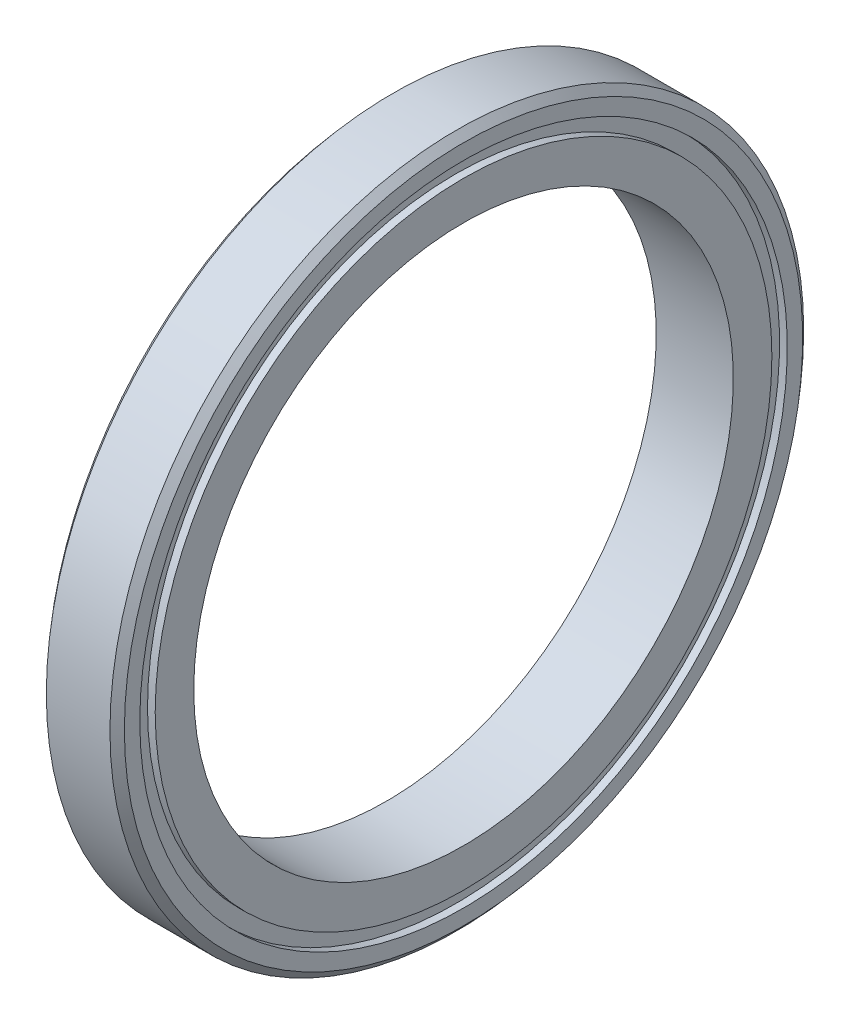
ISO-10303-21;
HEADER;
FILE_DESCRIPTION(('STEP AP214'),'2;1');
FILE_NAME('part.step','',(''),(''),'','','');
FILE_SCHEMA(('AUTOMOTIVE_DESIGN { 1 0 10303 214 1 1 1 1 }'));
ENDSEC;
DATA;
#1=APPLICATION_CONTEXT('core data for automotive mechanical design processes');
#2=APPLICATION_PROTOCOL_DEFINITION('international standard','automotive_design',2000,#1);
#3=PRODUCT_CONTEXT('',#1,'mechanical');
#4=PRODUCT('Part','Part','',(#3));
#5=PRODUCT_RELATED_PRODUCT_CATEGORY('part','',(#4));
#6=PRODUCT_DEFINITION_FORMATION('','',#4);
#7=PRODUCT_DEFINITION_CONTEXT('part definition',#1,'design');
#8=PRODUCT_DEFINITION('design','',#6,#7);
#9=PRODUCT_DEFINITION_SHAPE('','',#8);
#10=(LENGTH_UNIT() NAMED_UNIT(*) SI_UNIT(.MILLI.,.METRE.));
#11=(NAMED_UNIT(*) PLANE_ANGLE_UNIT() SI_UNIT($,.RADIAN.));
#12=(NAMED_UNIT(*) SI_UNIT($,.STERADIAN.) SOLID_ANGLE_UNIT());
#13=UNCERTAINTY_MEASURE_WITH_UNIT(LENGTH_MEASURE(1.E-05),#10,'distance_accuracy_value','');
#14=(GEOMETRIC_REPRESENTATION_CONTEXT(3) GLOBAL_UNCERTAINTY_ASSIGNED_CONTEXT((#13)) GLOBAL_UNIT_ASSIGNED_CONTEXT((#10,
#11,#12)) REPRESENTATION_CONTEXT('',''));
#15=CARTESIAN_POINT('',(0.,0.,0.));
#16=DIRECTION('',(0.,0.,1.));
#17=DIRECTION('',(1.,0.,0.));
#18=AXIS2_PLACEMENT_3D('',#15,#16,#17);
#19=CARTESIAN_POINT('',(2.84469849092037,35.,0.));
#20=DIRECTION('',(-1.,0.,0.));
#21=DIRECTION('',(0.,0.,1.));
#22=AXIS2_PLACEMENT_3D('',#19,#20,#21);
#23=PLANE('',#22);
#24=CARTESIAN_POINT('',(2.84469849092037,0.,0.));
#25=DIRECTION('',(-1.,0.,0.));
#26=DIRECTION('',(0.,0.,1.));
#27=AXIS2_PLACEMENT_3D('',#24,#25,#26);
#28=CIRCLE('',#27,40.);
#29=CARTESIAN_POINT('',(2.84469849092037,0.,40.));
#30=VERTEX_POINT('',#29);
#31=EDGE_CURVE('E10',#30,#30,#28,.T.);
#32=ORIENTED_EDGE('',*,*,#31,.F.);
#33=EDGE_LOOP('',(#32));
#34=FACE_BOUND('',#33,.T.);
#35=CARTESIAN_POINT('',(2.84469849092037,0.,0.));
#36=DIRECTION('',(-1.,0.,0.));
#37=DIRECTION('',(0.,0.,1.));
#38=AXIS2_PLACEMENT_3D('',#35,#36,#37);
#39=CIRCLE('',#38,35.);
#40=CARTESIAN_POINT('',(2.84469849092037,0.,35.));
#41=VERTEX_POINT('',#40);
#42=EDGE_CURVE('E77',#41,#41,#39,.T.);
#43=ORIENTED_EDGE('',*,*,#42,.T.);
#44=EDGE_LOOP('',(#43));
#45=FACE_BOUND('',#44,.T.);
#46=ADVANCED_FACE('F31',(#34,#45),#23,.F.);
#47=CARTESIAN_POINT('',(0.,0.,0.));
#48=DIRECTION('',(-1.,0.,0.));
#49=DIRECTION('',(0.,0.,1.));
#50=AXIS2_PLACEMENT_3D('',#47,#48,#49);
#51=CYLINDRICAL_SURFACE('',#50,40.);
#52=CARTESIAN_POINT('',(1.84469849092037,0.,0.));
#53=DIRECTION('',(-1.,0.,0.));
#54=DIRECTION('',(0.,0.,1.));
#55=AXIS2_PLACEMENT_3D('',#52,#53,#54);
#56=CIRCLE('',#55,40.);
#57=CARTESIAN_POINT('',(1.84469849092037,0.,40.));
#58=VERTEX_POINT('',#57);
#59=EDGE_CURVE('E37',#58,#58,#56,.T.);
#60=ORIENTED_EDGE('',*,*,#59,.F.);
#61=EDGE_LOOP('',(#60));
#62=FACE_BOUND('',#61,.T.);
#63=ORIENTED_EDGE('',*,*,#31,.T.);
#64=EDGE_LOOP('',(#63));
#65=FACE_BOUND('',#64,.T.);
#66=ADVANCED_FACE('F150',(#62,#65),#51,.T.);
#67=CARTESIAN_POINT('',(1.84469849092037,40.,0.));
#68=DIRECTION('',(-1.,0.,0.));
#69=DIRECTION('',(0.,0.,1.));
#70=AXIS2_PLACEMENT_3D('',#67,#68,#69);
#71=PLANE('',#70);
#72=CARTESIAN_POINT('',(1.84469849092037,0.,0.));
#73=DIRECTION('',(-1.,0.,0.));
#74=DIRECTION('',(0.,0.,1.));
#75=AXIS2_PLACEMENT_3D('',#72,#73,#74);
#76=CIRCLE('',#75,42.);
#77=CARTESIAN_POINT('',(1.84469849092037,0.,42.));
#78=VERTEX_POINT('',#77);
#79=EDGE_CURVE('E41',#78,#78,#76,.T.);
#80=ORIENTED_EDGE('',*,*,#79,.F.);
#81=EDGE_LOOP('',(#80));
#82=FACE_BOUND('',#81,.T.);
#83=ORIENTED_EDGE('',*,*,#59,.T.);
#84=EDGE_LOOP('',(#83));
#85=FACE_BOUND('',#84,.T.);
#86=ADVANCED_FACE('F145',(#82,#85),#71,.F.);
#87=CARTESIAN_POINT('',(0.,0.,0.));
#88=DIRECTION('',(-1.,0.,0.));
#89=DIRECTION('',(0.,0.,1.));
#90=AXIS2_PLACEMENT_3D('',#87,#88,#89);
#91=CYLINDRICAL_SURFACE('',#90,42.);
#92=CARTESIAN_POINT('',(2.84469849092037,0.,0.));
#93=DIRECTION('',(-1.,0.,0.));
#94=DIRECTION('',(0.,0.,1.));
#95=AXIS2_PLACEMENT_3D('',#92,#93,#94);
#96=CIRCLE('',#95,42.);
#97=CARTESIAN_POINT('',(2.84469849092037,0.,42.));
#98=VERTEX_POINT('',#97);
#99=EDGE_CURVE('E45',#98,#98,#96,.T.);
#100=ORIENTED_EDGE('',*,*,#99,.F.);
#101=EDGE_LOOP('',(#100));
#102=FACE_BOUND('',#101,.T.);
#103=ORIENTED_EDGE('',*,*,#79,.T.);
#104=EDGE_LOOP('',(#103));
#105=FACE_BOUND('',#104,.T.);
#106=ADVANCED_FACE('F139',(#102,#105),#91,.F.);
#107=CARTESIAN_POINT('',(2.84469849092037,42.,0.));
#108=DIRECTION('',(-1.,0.,0.));
#109=DIRECTION('',(0.,0.,1.));
#110=AXIS2_PLACEMENT_3D('',#107,#108,#109);
#111=PLANE('',#110);
#112=CARTESIAN_POINT('',(2.84469849092037,0.,0.));
#113=DIRECTION('',(-1.,0.,0.));
#114=DIRECTION('',(0.,0.,1.));
#115=AXIS2_PLACEMENT_3D('',#112,#113,#114);
#116=CIRCLE('',#115,44.);
#117=CARTESIAN_POINT('',(2.84469849092037,0.,44.));
#118=VERTEX_POINT('',#117);
#119=EDGE_CURVE('E50',#118,#118,#116,.T.);
#120=ORIENTED_EDGE('',*,*,#119,.F.);
#121=EDGE_LOOP('',(#120));
#122=FACE_BOUND('',#121,.T.);
#123=ORIENTED_EDGE('',*,*,#99,.T.);
#124=EDGE_LOOP('',(#123));
#125=FACE_BOUND('',#124,.T.);
#126=ADVANCED_FACE('F133',(#122,#125),#111,.F.);
#127=CARTESIAN_POINT('',(2.84469849092037,0.,0.));
#128=DIRECTION('',(-1.,0.,0.));
#129=DIRECTION('',(0.,0.,1.));
#130=AXIS2_PLACEMENT_3D('',#127,#128,#129);
#131=CONICAL_SURFACE('',#130,44.,0.852995114383051);
#132=CARTESIAN_POINT('',(1.97151331029781,0.,0.));
#133=DIRECTION('',(-1.,0.,0.));
#134=DIRECTION('',(0.,0.,1.));
#135=AXIS2_PLACEMENT_3D('',#132,#133,#134);
#136=CIRCLE('',#135,45.);
#137=CARTESIAN_POINT('',(1.97151331029781,0.,45.));
#138=VERTEX_POINT('',#137);
#139=EDGE_CURVE('E53',#138,#138,#136,.T.);
#140=ORIENTED_EDGE('',*,*,#139,.F.);
#141=EDGE_LOOP('',(#140));
#142=FACE_BOUND('',#141,.T.);
#143=ORIENTED_EDGE('',*,*,#119,.T.);
#144=EDGE_LOOP('',(#143));
#145=FACE_BOUND('',#144,.T.);
#146=ADVANCED_FACE('F127',(#142,#145),#131,.T.);
#147=CARTESIAN_POINT('',(0.,0.,0.));
#148=DIRECTION('',(-1.,0.,0.));
#149=DIRECTION('',(0.,0.,1.));
#150=AXIS2_PLACEMENT_3D('',#147,#148,#149);
#151=CYLINDRICAL_SURFACE('',#150,45.);
#152=CARTESIAN_POINT('',(-6.28211632845708,0.,0.));
#153=DIRECTION('',(-1.,0.,0.));
#154=DIRECTION('',(0.,0.,1.));
#155=AXIS2_PLACEMENT_3D('',#152,#153,#154);
#156=CIRCLE('',#155,45.);
#157=CARTESIAN_POINT('',(-6.28211632845708,0.,45.));
#158=VERTEX_POINT('',#157);
#159=EDGE_CURVE('E56',#158,#158,#156,.T.);
#160=ORIENTED_EDGE('',*,*,#159,.F.);
#161=EDGE_LOOP('',(#160));
#162=FACE_BOUND('',#161,.T.);
#163=ORIENTED_EDGE('',*,*,#139,.T.);
#164=EDGE_LOOP('',(#163));
#165=FACE_BOUND('',#164,.T.);
#166=ADVANCED_FACE('F121',(#162,#165),#151,.T.);
#167=CARTESIAN_POINT('',(-6.28211632845708,0.,0.));
#168=DIRECTION('',(1.,0.,0.));
#169=DIRECTION('',(0.,0.,-1.));
#170=AXIS2_PLACEMENT_3D('',#167,#168,#169);
#171=CONICAL_SURFACE('',#170,45.,0.85299511438305);
#172=CARTESIAN_POINT('',(-7.15530150907963,0.,0.));
#173=DIRECTION('',(-1.,0.,0.));
#174=DIRECTION('',(0.,0.,1.));
#175=AXIS2_PLACEMENT_3D('',#172,#173,#174);
#176=CIRCLE('',#175,44.);
#177=CARTESIAN_POINT('',(-7.15530150907963,0.,44.));
#178=VERTEX_POINT('',#177);
#179=EDGE_CURVE('E59',#178,#178,#176,.T.);
#180=ORIENTED_EDGE('',*,*,#179,.F.);
#181=EDGE_LOOP('',(#180));
#182=FACE_BOUND('',#181,.T.);
#183=ORIENTED_EDGE('',*,*,#159,.T.);
#184=EDGE_LOOP('',(#183));
#185=FACE_BOUND('',#184,.T.);
#186=ADVANCED_FACE('F115',(#182,#185),#171,.T.);
#187=CARTESIAN_POINT('',(-7.15530150907963,42.,0.));
#188=DIRECTION('',(1.,0.,0.));
#189=DIRECTION('',(0.,0.,-1.));
#190=AXIS2_PLACEMENT_3D('',#187,#188,#189);
#191=PLANE('',#190);
#192=CARTESIAN_POINT('',(-7.15530150907963,0.,0.));
#193=DIRECTION('',(-1.,0.,0.));
#194=DIRECTION('',(0.,0.,1.));
#195=AXIS2_PLACEMENT_3D('',#192,#193,#194);
#196=CIRCLE('',#195,42.);
#197=CARTESIAN_POINT('',(-7.15530150907963,0.,42.));
#198=VERTEX_POINT('',#197);
#199=EDGE_CURVE('E62',#198,#198,#196,.T.);
#200=ORIENTED_EDGE('',*,*,#199,.F.);
#201=EDGE_LOOP('',(#200));
#202=FACE_BOUND('',#201,.T.);
#203=ORIENTED_EDGE('',*,*,#179,.T.);
#204=EDGE_LOOP('',(#203));
#205=FACE_BOUND('',#204,.T.);
#206=ADVANCED_FACE('F109',(#202,#205),#191,.F.);
#207=CARTESIAN_POINT('',(0.,0.,0.));
#208=DIRECTION('',(-1.,0.,0.));
#209=DIRECTION('',(0.,0.,1.));
#210=AXIS2_PLACEMENT_3D('',#207,#208,#209);
#211=CYLINDRICAL_SURFACE('',#210,42.);
#212=CARTESIAN_POINT('',(-6.15530150907963,0.,0.));
#213=DIRECTION('',(-1.,0.,0.));
#214=DIRECTION('',(0.,0.,1.));
#215=AXIS2_PLACEMENT_3D('',#212,#213,#214);
#216=CIRCLE('',#215,42.);
#217=CARTESIAN_POINT('',(-6.15530150907963,0.,42.));
#218=VERTEX_POINT('',#217);
#219=EDGE_CURVE('E65',#218,#218,#216,.T.);
#220=ORIENTED_EDGE('',*,*,#219,.F.);
#221=EDGE_LOOP('',(#220));
#222=FACE_BOUND('',#221,.T.);
#223=ORIENTED_EDGE('',*,*,#199,.T.);
#224=EDGE_LOOP('',(#223));
#225=FACE_BOUND('',#224,.T.);
#226=ADVANCED_FACE('F103',(#222,#225),#211,.F.);
#227=CARTESIAN_POINT('',(-6.15530150907963,40.,0.));
#228=DIRECTION('',(1.,0.,0.));
#229=DIRECTION('',(0.,0.,-1.));
#230=AXIS2_PLACEMENT_3D('',#227,#228,#229);
#231=PLANE('',#230);
#232=CARTESIAN_POINT('',(-6.15530150907963,0.,0.));
#233=DIRECTION('',(-1.,0.,0.));
#234=DIRECTION('',(0.,0.,1.));
#235=AXIS2_PLACEMENT_3D('',#232,#233,#234);
#236=CIRCLE('',#235,40.);
#237=CARTESIAN_POINT('',(-6.15530150907963,0.,40.));
#238=VERTEX_POINT('',#237);
#239=EDGE_CURVE('E68',#238,#238,#236,.T.);
#240=ORIENTED_EDGE('',*,*,#239,.F.);
#241=EDGE_LOOP('',(#240));
#242=FACE_BOUND('',#241,.T.);
#243=ORIENTED_EDGE('',*,*,#219,.T.);
#244=EDGE_LOOP('',(#243));
#245=FACE_BOUND('',#244,.T.);
#246=ADVANCED_FACE('F97',(#242,#245),#231,.F.);
#247=CARTESIAN_POINT('',(0.,0.,0.));
#248=DIRECTION('',(-1.,0.,0.));
#249=DIRECTION('',(0.,0.,1.));
#250=AXIS2_PLACEMENT_3D('',#247,#248,#249);
#251=CYLINDRICAL_SURFACE('',#250,40.);
#252=CARTESIAN_POINT('',(-7.15530150907963,0.,0.));
#253=DIRECTION('',(-1.,0.,0.));
#254=DIRECTION('',(0.,0.,1.));
#255=AXIS2_PLACEMENT_3D('',#252,#253,#254);
#256=CIRCLE('',#255,40.);
#257=CARTESIAN_POINT('',(-7.15530150907963,0.,40.));
#258=VERTEX_POINT('',#257);
#259=EDGE_CURVE('E71',#258,#258,#256,.T.);
#260=ORIENTED_EDGE('',*,*,#259,.F.);
#261=EDGE_LOOP('',(#260));
#262=FACE_BOUND('',#261,.T.);
#263=ORIENTED_EDGE('',*,*,#239,.T.);
#264=EDGE_LOOP('',(#263));
#265=FACE_BOUND('',#264,.T.);
#266=ADVANCED_FACE('F91',(#262,#265),#251,.T.);
#267=CARTESIAN_POINT('',(-7.15530150907963,35.,0.));
#268=DIRECTION('',(1.,0.,0.));
#269=DIRECTION('',(0.,0.,-1.));
#270=AXIS2_PLACEMENT_3D('',#267,#268,#269);
#271=PLANE('',#270);
#272=CARTESIAN_POINT('',(-7.15530150907964,0.,0.));
#273=DIRECTION('',(-1.,0.,0.));
#274=DIRECTION('',(0.,0.,1.));
#275=AXIS2_PLACEMENT_3D('',#272,#273,#274);
#276=CIRCLE('',#275,35.);
#277=CARTESIAN_POINT('',(-7.15530150907964,0.,35.));
#278=VERTEX_POINT('',#277);
#279=EDGE_CURVE('E74',#278,#278,#276,.T.);
#280=ORIENTED_EDGE('',*,*,#279,.F.);
#281=EDGE_LOOP('',(#280));
#282=FACE_BOUND('',#281,.T.);
#283=ORIENTED_EDGE('',*,*,#259,.T.);
#284=EDGE_LOOP('',(#283));
#285=FACE_BOUND('',#284,.T.);
#286=ADVANCED_FACE('F85',(#282,#285),#271,.F.);
#287=CARTESIAN_POINT('',(0.,0.,0.));
#288=DIRECTION('',(-1.,0.,0.));
#289=DIRECTION('',(0.,0.,1.));
#290=AXIS2_PLACEMENT_3D('',#287,#288,#289);
#291=CYLINDRICAL_SURFACE('',#290,35.);
#292=ORIENTED_EDGE('',*,*,#42,.F.);
#293=EDGE_LOOP('',(#292));
#294=FACE_BOUND('',#293,.T.);
#295=ORIENTED_EDGE('',*,*,#279,.T.);
#296=EDGE_LOOP('',(#295));
#297=FACE_BOUND('',#296,.T.);
#298=ADVANCED_FACE('F82',(#294,#297),#291,.F.);
#299=CLOSED_SHELL('',(#46,#66,#86,#106,#126,#146,#166,#186,#206,#226,#246,#266,#286,#298));
#300=MANIFOLD_SOLID_BREP('B2',#299);
#301=ADVANCED_BREP_SHAPE_REPRESENTATION('',(#18,#300),#14);
#302=SHAPE_DEFINITION_REPRESENTATION(#9,#301);
ENDSEC;
END-ISO-10303-21;
